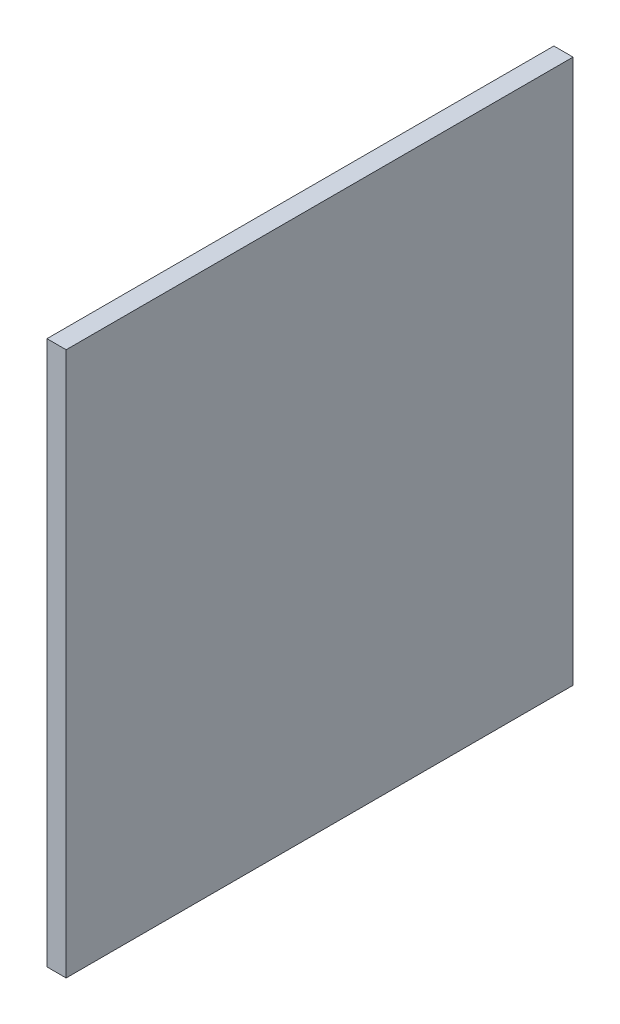
ISO-10303-21;
HEADER;
FILE_DESCRIPTION(('STEP AP214'),'2;1');
FILE_NAME('part.step','',(''),(''),'','','');
FILE_SCHEMA(('AUTOMOTIVE_DESIGN { 1 0 10303 214 1 1 1 1 }'));
ENDSEC;
DATA;
#1=APPLICATION_CONTEXT('core data for automotive mechanical design processes');
#2=APPLICATION_PROTOCOL_DEFINITION('international standard','automotive_design',2000,#1);
#3=PRODUCT_CONTEXT('',#1,'mechanical');
#4=PRODUCT('Part','Part','',(#3));
#5=PRODUCT_RELATED_PRODUCT_CATEGORY('part','',(#4));
#6=PRODUCT_DEFINITION_FORMATION('','',#4);
#7=PRODUCT_DEFINITION_CONTEXT('part definition',#1,'design');
#8=PRODUCT_DEFINITION('design','',#6,#7);
#9=PRODUCT_DEFINITION_SHAPE('','',#8);
#10=(LENGTH_UNIT() NAMED_UNIT(*) SI_UNIT(.MILLI.,.METRE.));
#11=(NAMED_UNIT(*) PLANE_ANGLE_UNIT() SI_UNIT($,.RADIAN.));
#12=(NAMED_UNIT(*) SI_UNIT($,.STERADIAN.) SOLID_ANGLE_UNIT());
#13=UNCERTAINTY_MEASURE_WITH_UNIT(LENGTH_MEASURE(1.E-05),#10,'distance_accuracy_value','');
#14=(GEOMETRIC_REPRESENTATION_CONTEXT(3) GLOBAL_UNCERTAINTY_ASSIGNED_CONTEXT((#13)) GLOBAL_UNIT_ASSIGNED_CONTEXT((#10,
#11,#12)) REPRESENTATION_CONTEXT('',''));
#15=CARTESIAN_POINT('',(0.,0.,0.));
#16=DIRECTION('',(0.,0.,1.));
#17=DIRECTION('',(1.,0.,0.));
#18=AXIS2_PLACEMENT_3D('',#15,#16,#17);
#19=CARTESIAN_POINT('',(6.35,-90.,83.85));
#20=DIRECTION('',(0.,0.,-1.));
#21=DIRECTION('',(-1.,0.,0.));
#22=AXIS2_PLACEMENT_3D('',#19,#20,#21);
#23=PLANE('',#22);
#24=DIRECTION('',(0.,-1.,0.));
#25=VECTOR('',#24,1.);
#26=CARTESIAN_POINT('',(0.,-90.,83.85));
#27=LINE('',#26,#25);
#28=CARTESIAN_POINT('',(0.,90.,83.85));
#29=VERTEX_POINT('',#28);
#30=CARTESIAN_POINT('',(0.,-90.,83.85));
#31=VERTEX_POINT('',#30);
#32=EDGE_CURVE('E96',#29,#31,#27,.T.);
#33=ORIENTED_EDGE('',*,*,#32,.T.);
#34=DIRECTION('',(-1.,0.,0.));
#35=VECTOR('',#34,1.);
#36=CARTESIAN_POINT('',(6.35,-90.,83.85));
#37=LINE('',#36,#35);
#38=CARTESIAN_POINT('',(6.35,-90.,83.85));
#39=VERTEX_POINT('',#38);
#40=EDGE_CURVE('E11',#39,#31,#37,.T.);
#41=ORIENTED_EDGE('',*,*,#40,.F.);
#42=DIRECTION('',(0.,-1.,0.));
#43=VECTOR('',#42,1.);
#44=CARTESIAN_POINT('',(6.35,-90.,83.85));
#45=LINE('',#44,#43);
#46=CARTESIAN_POINT('',(6.35,90.,83.85));
#47=VERTEX_POINT('',#46);
#48=EDGE_CURVE('E84',#47,#39,#45,.T.);
#49=ORIENTED_EDGE('',*,*,#48,.F.);
#50=DIRECTION('',(-1.,0.,0.));
#51=VECTOR('',#50,1.);
#52=CARTESIAN_POINT('',(6.35,90.,83.85));
#53=LINE('',#52,#51);
#54=EDGE_CURVE('E92',#47,#29,#53,.T.);
#55=ORIENTED_EDGE('',*,*,#54,.T.);
#56=EDGE_LOOP('',(#33,#41,#49,#55));
#57=FACE_BOUND('',#56,.T.);
#58=ADVANCED_FACE('F33',(#57),#23,.F.);
#59=CARTESIAN_POINT('',(6.35,-90.,-83.85));
#60=DIRECTION('',(0.,1.,0.));
#61=DIRECTION('',(0.,0.,1.));
#62=AXIS2_PLACEMENT_3D('',#59,#60,#61);
#63=PLANE('',#62);
#64=DIRECTION('',(0.,0.,-1.));
#65=VECTOR('',#64,1.);
#66=CARTESIAN_POINT('',(0.,-90.,-83.85));
#67=LINE('',#66,#65);
#68=CARTESIAN_POINT('',(0.,-90.,-83.85));
#69=VERTEX_POINT('',#68);
#70=EDGE_CURVE('E88',#31,#69,#67,.T.);
#71=ORIENTED_EDGE('',*,*,#70,.T.);
#72=DIRECTION('',(-1.,0.,0.));
#73=VECTOR('',#72,1.);
#74=CARTESIAN_POINT('',(6.35,-90.,-83.85));
#75=LINE('',#74,#73);
#76=CARTESIAN_POINT('',(6.35,-90.,-83.85));
#77=VERTEX_POINT('',#76);
#78=EDGE_CURVE('E41',#77,#69,#75,.T.);
#79=ORIENTED_EDGE('',*,*,#78,.F.);
#80=DIRECTION('',(0.,0.,-1.));
#81=VECTOR('',#80,1.);
#82=CARTESIAN_POINT('',(6.35,-90.,-83.85));
#83=LINE('',#82,#81);
#84=EDGE_CURVE('E79',#39,#77,#83,.T.);
#85=ORIENTED_EDGE('',*,*,#84,.F.);
#86=ORIENTED_EDGE('',*,*,#40,.T.);
#87=EDGE_LOOP('',(#71,#79,#85,#86));
#88=FACE_BOUND('',#87,.T.);
#89=ADVANCED_FACE('F87',(#88),#63,.F.);
#90=CARTESIAN_POINT('',(6.35,-90.,-83.85));
#91=DIRECTION('',(0.,0.,1.));
#92=DIRECTION('',(1.,0.,0.));
#93=AXIS2_PLACEMENT_3D('',#90,#91,#92);
#94=PLANE('',#93);
#95=DIRECTION('',(0.,1.,0.));
#96=VECTOR('',#95,1.);
#97=CARTESIAN_POINT('',(0.,-90.,-83.85));
#98=LINE('',#97,#96);
#99=CARTESIAN_POINT('',(0.,90.,-83.85));
#100=VERTEX_POINT('',#99);
#101=EDGE_CURVE('E66',#69,#100,#98,.T.);
#102=ORIENTED_EDGE('',*,*,#101,.T.);
#103=DIRECTION('',(-1.,0.,0.));
#104=VECTOR('',#103,1.);
#105=CARTESIAN_POINT('',(6.35,90.,-83.85));
#106=LINE('',#105,#104);
#107=CARTESIAN_POINT('',(6.35,90.,-83.85));
#108=VERTEX_POINT('',#107);
#109=EDGE_CURVE('E89',#108,#100,#106,.T.);
#110=ORIENTED_EDGE('',*,*,#109,.F.);
#111=DIRECTION('',(0.,1.,0.));
#112=VECTOR('',#111,1.);
#113=CARTESIAN_POINT('',(6.35,-90.,-83.85));
#114=LINE('',#113,#112);
#115=EDGE_CURVE('E82',#77,#108,#114,.T.);
#116=ORIENTED_EDGE('',*,*,#115,.F.);
#117=ORIENTED_EDGE('',*,*,#78,.T.);
#118=EDGE_LOOP('',(#102,#110,#116,#117));
#119=FACE_BOUND('',#118,.T.);
#120=ADVANCED_FACE('F90',(#119),#94,.F.);
#121=CARTESIAN_POINT('',(6.35,90.,-83.85));
#122=DIRECTION('',(0.,-1.,0.));
#123=DIRECTION('',(0.,0.,-1.));
#124=AXIS2_PLACEMENT_3D('',#121,#122,#123);
#125=PLANE('',#124);
#126=DIRECTION('',(0.,0.,1.));
#127=VECTOR('',#126,1.);
#128=CARTESIAN_POINT('',(0.,90.,-83.85));
#129=LINE('',#128,#127);
#130=EDGE_CURVE('E72',#100,#29,#129,.T.);
#131=ORIENTED_EDGE('',*,*,#130,.T.);
#132=ORIENTED_EDGE('',*,*,#54,.F.);
#133=DIRECTION('',(0.,0.,1.));
#134=VECTOR('',#133,1.);
#135=CARTESIAN_POINT('',(6.35,90.,-83.85));
#136=LINE('',#135,#134);
#137=EDGE_CURVE('E49',#108,#47,#136,.T.);
#138=ORIENTED_EDGE('',*,*,#137,.F.);
#139=ORIENTED_EDGE('',*,*,#109,.T.);
#140=EDGE_LOOP('',(#131,#132,#138,#139));
#141=FACE_BOUND('',#140,.T.);
#142=ADVANCED_FACE('F103',(#141),#125,.F.);
#143=CARTESIAN_POINT('',(6.35,0.,0.));
#144=DIRECTION('',(1.,0.,0.));
#145=DIRECTION('',(0.,0.,-1.));
#146=AXIS2_PLACEMENT_3D('',#143,#144,#145);
#147=PLANE('',#146);
#148=ORIENTED_EDGE('',*,*,#48,.T.);
#149=ORIENTED_EDGE('',*,*,#84,.T.);
#150=ORIENTED_EDGE('',*,*,#115,.T.);
#151=ORIENTED_EDGE('',*,*,#137,.T.);
#152=EDGE_LOOP('',(#148,#149,#150,#151));
#153=FACE_BOUND('',#152,.T.);
#154=ADVANCED_FACE('F80',(#153),#147,.T.);
#155=CARTESIAN_POINT('',(0.,0.,0.));
#156=DIRECTION('',(1.,0.,0.));
#157=DIRECTION('',(0.,0.,-1.));
#158=AXIS2_PLACEMENT_3D('',#155,#156,#157);
#159=PLANE('',#158);
#160=ORIENTED_EDGE('',*,*,#32,.F.);
#161=ORIENTED_EDGE('',*,*,#130,.F.);
#162=ORIENTED_EDGE('',*,*,#101,.F.);
#163=ORIENTED_EDGE('',*,*,#70,.F.);
#164=EDGE_LOOP('',(#160,#161,#162,#163));
#165=FACE_BOUND('',#164,.T.);
#166=ADVANCED_FACE('F106',(#165),#159,.F.);
#167=CLOSED_SHELL('',(#58,#89,#120,#142,#154,#166));
#168=MANIFOLD_SOLID_BREP('B2',#167);
#169=ADVANCED_BREP_SHAPE_REPRESENTATION('',(#18,#168),#14);
#170=SHAPE_DEFINITION_REPRESENTATION(#9,#169);
ENDSEC;
END-ISO-10303-21;
